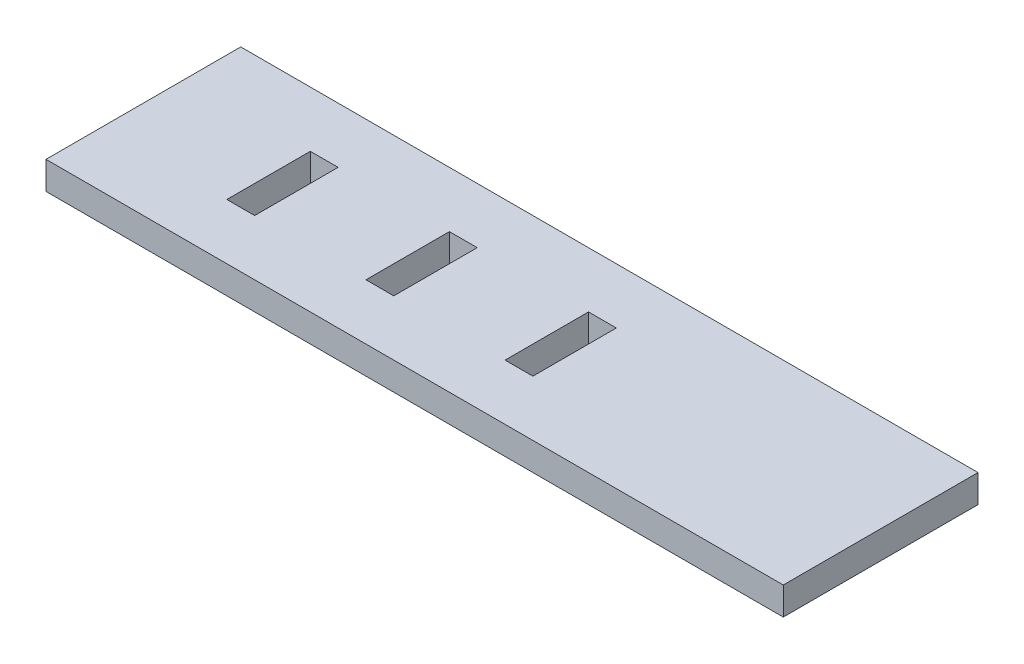
ISO-10303-21;
HEADER;
FILE_DESCRIPTION(('STEP AP214'),'2;1');
FILE_NAME('part.step','',(''),(''),'','','');
FILE_SCHEMA(('AUTOMOTIVE_DESIGN { 1 0 10303 214 1 1 1 1 }'));
ENDSEC;
DATA;
#1=APPLICATION_CONTEXT('core data for automotive mechanical design processes');
#2=APPLICATION_PROTOCOL_DEFINITION('international standard','automotive_design',2000,#1);
#3=PRODUCT_CONTEXT('',#1,'mechanical');
#4=PRODUCT('Part','Part','',(#3));
#5=PRODUCT_RELATED_PRODUCT_CATEGORY('part','',(#4));
#6=PRODUCT_DEFINITION_FORMATION('','',#4);
#7=PRODUCT_DEFINITION_CONTEXT('part definition',#1,'design');
#8=PRODUCT_DEFINITION('design','',#6,#7);
#9=PRODUCT_DEFINITION_SHAPE('','',#8);
#10=(LENGTH_UNIT() NAMED_UNIT(*) SI_UNIT(.MILLI.,.METRE.));
#11=(NAMED_UNIT(*) PLANE_ANGLE_UNIT() SI_UNIT($,.RADIAN.));
#12=(NAMED_UNIT(*) SI_UNIT($,.STERADIAN.) SOLID_ANGLE_UNIT());
#13=UNCERTAINTY_MEASURE_WITH_UNIT(LENGTH_MEASURE(1.E-05),#10,'distance_accuracy_value','');
#14=(GEOMETRIC_REPRESENTATION_CONTEXT(3) GLOBAL_UNCERTAINTY_ASSIGNED_CONTEXT((#13)) GLOBAL_UNIT_ASSIGNED_CONTEXT((#10,
#11,#12)) REPRESENTATION_CONTEXT('',''));
#15=CARTESIAN_POINT('',(0.,0.,0.));
#16=DIRECTION('',(0.,0.,1.));
#17=DIRECTION('',(1.,0.,0.));
#18=AXIS2_PLACEMENT_3D('',#15,#16,#17);
#19=CARTESIAN_POINT('',(0.,10.,0.));
#20=DIRECTION('',(0.,1.,0.));
#21=DIRECTION('',(0.,0.,1.));
#22=AXIS2_PLACEMENT_3D('',#19,#20,#21);
#23=PLANE('',#22);
#24=DIRECTION('',(0.,0.,1.));
#25=VECTOR('',#24,1.);
#26=CARTESIAN_POINT('',(-98.4246575342466,10.,-43.4931506849315));
#27=LINE('',#26,#25);
#28=CARTESIAN_POINT('',(-98.4246575342466,10.,-43.4931506849315));
#29=VERTEX_POINT('',#28);
#30=CARTESIAN_POINT('',(-98.4246575342466,10.,26.5068493150685));
#31=VERTEX_POINT('',#30);
#32=EDGE_CURVE('E246',#29,#31,#27,.T.);
#33=ORIENTED_EDGE('',*,*,#32,.T.);
#34=DIRECTION('',(1.,0.,0.));
#35=VECTOR('',#34,1.);
#36=CARTESIAN_POINT('',(-98.4246575342466,10.,26.5068493150685));
#37=LINE('',#36,#35);
#38=CARTESIAN_POINT('',(166.575342465753,10.,26.5068493150685));
#39=VERTEX_POINT('',#38);
#40=EDGE_CURVE('E249',#31,#39,#37,.T.);
#41=ORIENTED_EDGE('',*,*,#40,.T.);
#42=DIRECTION('',(0.,0.,-1.));
#43=VECTOR('',#42,1.);
#44=CARTESIAN_POINT('',(166.575342465753,10.,-43.4931506849315));
#45=LINE('',#44,#43);
#46=CARTESIAN_POINT('',(166.575342465753,10.,-43.4931506849315));
#47=VERTEX_POINT('',#46);
#48=EDGE_CURVE('E252',#39,#47,#45,.T.);
#49=ORIENTED_EDGE('',*,*,#48,.T.);
#50=DIRECTION('',(-1.,0.,0.));
#51=VECTOR('',#50,1.);
#52=CARTESIAN_POINT('',(-98.4246575342466,10.,-43.4931506849315));
#53=LINE('',#52,#51);
#54=EDGE_CURVE('E254',#47,#29,#53,.T.);
#55=ORIENTED_EDGE('',*,*,#54,.T.);
#56=EDGE_LOOP('',(#33,#41,#49,#55));
#57=FACE_BOUND('',#56,.T.);
#58=DIRECTION('',(-1.,0.,0.));
#59=VECTOR('',#58,1.);
#60=CARTESIAN_POINT('',(-53.4246575342466,10.,-23.4931506849315));
#61=LINE('',#60,#59);
#62=CARTESIAN_POINT('',(-43.4246575342466,10.,-23.4931506849315));
#63=VERTEX_POINT('',#62);
#64=CARTESIAN_POINT('',(-53.4246575342466,10.,-23.4931506849315));
#65=VERTEX_POINT('',#64);
#66=EDGE_CURVE('E217',#63,#65,#61,.T.);
#67=ORIENTED_EDGE('',*,*,#66,.F.);
#68=DIRECTION('',(0.,0.,-1.));
#69=VECTOR('',#68,1.);
#70=CARTESIAN_POINT('',(-43.4246575342466,10.,-23.4931506849315));
#71=LINE('',#70,#69);
#72=CARTESIAN_POINT('',(-43.4246575342466,10.,6.50684931506849));
#73=VERTEX_POINT('',#72);
#74=EDGE_CURVE('E215',#73,#63,#71,.T.);
#75=ORIENTED_EDGE('',*,*,#74,.F.);
#76=DIRECTION('',(1.,0.,0.));
#77=VECTOR('',#76,1.);
#78=CARTESIAN_POINT('',(-53.4246575342466,10.,6.50684931506849));
#79=LINE('',#78,#77);
#80=CARTESIAN_POINT('',(-53.4246575342466,10.,6.50684931506849));
#81=VERTEX_POINT('',#80);
#82=EDGE_CURVE('E223',#81,#73,#79,.T.);
#83=ORIENTED_EDGE('',*,*,#82,.F.);
#84=DIRECTION('',(0.,0.,1.));
#85=VECTOR('',#84,1.);
#86=CARTESIAN_POINT('',(-53.4246575342466,10.,-23.4931506849315));
#87=LINE('',#86,#85);
#88=EDGE_CURVE('E220',#65,#81,#87,.T.);
#89=ORIENTED_EDGE('',*,*,#88,.F.);
#90=EDGE_LOOP('',(#67,#75,#83,#89));
#91=FACE_BOUND('',#90,.T.);
#92=DIRECTION('',(1.,0.,0.));
#93=VECTOR('',#92,1.);
#94=CARTESIAN_POINT('',(6.57534246575341,10.,6.50684931506847));
#95=LINE('',#94,#93);
#96=CARTESIAN_POINT('',(-3.42465753424659,10.,6.50684931506847));
#97=VERTEX_POINT('',#96);
#98=CARTESIAN_POINT('',(6.57534246575341,10.,6.50684931506847));
#99=VERTEX_POINT('',#98);
#100=EDGE_CURVE('E186',#97,#99,#95,.T.);
#101=ORIENTED_EDGE('',*,*,#100,.F.);
#102=DIRECTION('',(0.,0.,1.));
#103=VECTOR('',#102,1.);
#104=CARTESIAN_POINT('',(-3.4246575342466,10.,-23.4931506849315));
#105=LINE('',#104,#103);
#106=CARTESIAN_POINT('',(-3.4246575342466,10.,-23.4931506849315));
#107=VERTEX_POINT('',#106);
#108=EDGE_CURVE('E184',#107,#97,#105,.T.);
#109=ORIENTED_EDGE('',*,*,#108,.F.);
#110=DIRECTION('',(-1.,0.,0.));
#111=VECTOR('',#110,1.);
#112=CARTESIAN_POINT('',(6.5753424657534,10.,-23.4931506849315));
#113=LINE('',#112,#111);
#114=CARTESIAN_POINT('',(6.5753424657534,10.,-23.4931506849315));
#115=VERTEX_POINT('',#114);
#116=EDGE_CURVE('E192',#115,#107,#113,.T.);
#117=ORIENTED_EDGE('',*,*,#116,.F.);
#118=DIRECTION('',(0.,0.,-1.));
#119=VECTOR('',#118,1.);
#120=CARTESIAN_POINT('',(6.5753424657534,10.,-23.4931506849315));
#121=LINE('',#120,#119);
#122=EDGE_CURVE('E189',#99,#115,#121,.T.);
#123=ORIENTED_EDGE('',*,*,#122,.F.);
#124=EDGE_LOOP('',(#101,#109,#117,#123));
#125=FACE_BOUND('',#124,.T.);
#126=DIRECTION('',(-1.,0.,0.));
#127=VECTOR('',#126,1.);
#128=CARTESIAN_POINT('',(46.5753424657534,10.,-23.4931506849315));
#129=LINE('',#128,#127);
#130=CARTESIAN_POINT('',(56.5753424657534,10.,-23.4931506849315));
#131=VERTEX_POINT('',#130);
#132=CARTESIAN_POINT('',(46.5753424657534,10.,-23.4931506849315));
#133=VERTEX_POINT('',#132);
#134=EDGE_CURVE('E156',#131,#133,#129,.T.);
#135=ORIENTED_EDGE('',*,*,#134,.F.);
#136=DIRECTION('',(0.,0.,-1.));
#137=VECTOR('',#136,1.);
#138=CARTESIAN_POINT('',(56.5753424657534,10.,-23.4931506849315));
#139=LINE('',#138,#137);
#140=CARTESIAN_POINT('',(56.5753424657534,10.,6.50684931506852));
#141=VERTEX_POINT('',#140);
#142=EDGE_CURVE('E148',#141,#131,#139,.T.);
#143=ORIENTED_EDGE('',*,*,#142,.F.);
#144=DIRECTION('',(1.,0.,0.));
#145=VECTOR('',#144,1.);
#146=CARTESIAN_POINT('',(46.5753424657534,10.,6.50684931506852));
#147=LINE('',#146,#145);
#148=CARTESIAN_POINT('',(46.5753424657534,10.,6.50684931506852));
#149=VERTEX_POINT('',#148);
#150=EDGE_CURVE('E170',#149,#141,#147,.T.);
#151=ORIENTED_EDGE('',*,*,#150,.F.);
#152=DIRECTION('',(0.,0.,1.));
#153=VECTOR('',#152,1.);
#154=CARTESIAN_POINT('',(46.5753424657534,10.,-23.4931506849315));
#155=LINE('',#154,#153);
#156=EDGE_CURVE('E168',#133,#149,#155,.T.);
#157=ORIENTED_EDGE('',*,*,#156,.F.);
#158=EDGE_LOOP('',(#135,#143,#151,#157));
#159=FACE_BOUND('',#158,.T.);
#160=ADVANCED_FACE('F35',(#57,#91,#125,#159),#23,.T.);
#161=CARTESIAN_POINT('',(0.,0.,0.));
#162=DIRECTION('',(0.,1.,0.));
#163=DIRECTION('',(0.,0.,1.));
#164=AXIS2_PLACEMENT_3D('',#161,#162,#163);
#165=PLANE('',#164);
#166=DIRECTION('',(0.,0.,1.));
#167=VECTOR('',#166,1.);
#168=CARTESIAN_POINT('',(-3.4246575342466,0.,-23.4931506849315));
#169=LINE('',#168,#167);
#170=CARTESIAN_POINT('',(-3.4246575342466,0.,-23.4931506849315));
#171=VERTEX_POINT('',#170);
#172=CARTESIAN_POINT('',(-3.42465753424659,0.,6.50684931506847));
#173=VERTEX_POINT('',#172);
#174=EDGE_CURVE('E164',#171,#173,#169,.T.);
#175=ORIENTED_EDGE('',*,*,#174,.T.);
#176=DIRECTION('',(1.,0.,0.));
#177=VECTOR('',#176,1.);
#178=CARTESIAN_POINT('',(6.57534246575341,0.,6.50684931506847));
#179=LINE('',#178,#177);
#180=CARTESIAN_POINT('',(6.57534246575341,0.,6.50684931506847));
#181=VERTEX_POINT('',#180);
#182=EDGE_CURVE('E197',#173,#181,#179,.T.);
#183=ORIENTED_EDGE('',*,*,#182,.T.);
#184=DIRECTION('',(0.,0.,-1.));
#185=VECTOR('',#184,1.);
#186=CARTESIAN_POINT('',(6.5753424657534,0.,-23.4931506849315));
#187=LINE('',#186,#185);
#188=CARTESIAN_POINT('',(6.5753424657534,0.,-23.4931506849315));
#189=VERTEX_POINT('',#188);
#190=EDGE_CURVE('E200',#181,#189,#187,.T.);
#191=ORIENTED_EDGE('',*,*,#190,.T.);
#192=DIRECTION('',(-1.,0.,0.));
#193=VECTOR('',#192,1.);
#194=CARTESIAN_POINT('',(6.5753424657534,0.,-23.4931506849315));
#195=LINE('',#194,#193);
#196=EDGE_CURVE('E187',#189,#171,#195,.T.);
#197=ORIENTED_EDGE('',*,*,#196,.T.);
#198=EDGE_LOOP('',(#175,#183,#191,#197));
#199=FACE_BOUND('',#198,.T.);
#200=DIRECTION('',(0.,0.,1.));
#201=VECTOR('',#200,1.);
#202=CARTESIAN_POINT('',(-98.4246575342466,0.,-43.4931506849315));
#203=LINE('',#202,#201);
#204=CARTESIAN_POINT('',(-98.4246575342466,0.,-43.4931506849315));
#205=VERTEX_POINT('',#204);
#206=CARTESIAN_POINT('',(-98.4246575342466,0.,26.5068493150685));
#207=VERTEX_POINT('',#206);
#208=EDGE_CURVE('E245',#205,#207,#203,.T.);
#209=ORIENTED_EDGE('',*,*,#208,.F.);
#210=DIRECTION('',(-1.,0.,0.));
#211=VECTOR('',#210,1.);
#212=CARTESIAN_POINT('',(-98.4246575342466,0.,-43.4931506849315));
#213=LINE('',#212,#211);
#214=CARTESIAN_POINT('',(166.575342465753,0.,-43.4931506849315));
#215=VERTEX_POINT('',#214);
#216=EDGE_CURVE('E250',#215,#205,#213,.T.);
#217=ORIENTED_EDGE('',*,*,#216,.F.);
#218=DIRECTION('',(0.,0.,-1.));
#219=VECTOR('',#218,1.);
#220=CARTESIAN_POINT('',(166.575342465753,0.,-43.4931506849315));
#221=LINE('',#220,#219);
#222=CARTESIAN_POINT('',(166.575342465753,0.,26.5068493150685));
#223=VERTEX_POINT('',#222);
#224=EDGE_CURVE('E261',#223,#215,#221,.T.);
#225=ORIENTED_EDGE('',*,*,#224,.F.);
#226=DIRECTION('',(1.,0.,0.));
#227=VECTOR('',#226,1.);
#228=CARTESIAN_POINT('',(-98.4246575342466,0.,26.5068493150685));
#229=LINE('',#228,#227);
#230=EDGE_CURVE('E259',#207,#223,#229,.T.);
#231=ORIENTED_EDGE('',*,*,#230,.F.);
#232=EDGE_LOOP('',(#209,#217,#225,#231));
#233=FACE_BOUND('',#232,.T.);
#234=DIRECTION('',(0.,0.,-1.));
#235=VECTOR('',#234,1.);
#236=CARTESIAN_POINT('',(-43.4246575342466,0.,-23.4931506849315));
#237=LINE('',#236,#235);
#238=CARTESIAN_POINT('',(-43.4246575342466,0.,6.50684931506849));
#239=VERTEX_POINT('',#238);
#240=CARTESIAN_POINT('',(-43.4246575342466,0.,-23.4931506849315));
#241=VERTEX_POINT('',#240);
#242=EDGE_CURVE('E214',#239,#241,#237,.T.);
#243=ORIENTED_EDGE('',*,*,#242,.T.);
#244=DIRECTION('',(-1.,0.,0.));
#245=VECTOR('',#244,1.);
#246=CARTESIAN_POINT('',(-53.4246575342466,0.,-23.4931506849315));
#247=LINE('',#246,#245);
#248=CARTESIAN_POINT('',(-53.4246575342466,0.,-23.4931506849315));
#249=VERTEX_POINT('',#248);
#250=EDGE_CURVE('E228',#241,#249,#247,.T.);
#251=ORIENTED_EDGE('',*,*,#250,.T.);
#252=DIRECTION('',(0.,0.,1.));
#253=VECTOR('',#252,1.);
#254=CARTESIAN_POINT('',(-53.4246575342466,0.,-23.4931506849315));
#255=LINE('',#254,#253);
#256=CARTESIAN_POINT('',(-53.4246575342466,0.,6.50684931506849));
#257=VERTEX_POINT('',#256);
#258=EDGE_CURVE('E231',#249,#257,#255,.T.);
#259=ORIENTED_EDGE('',*,*,#258,.T.);
#260=DIRECTION('',(1.,0.,0.));
#261=VECTOR('',#260,1.);
#262=CARTESIAN_POINT('',(-53.4246575342466,0.,6.50684931506849));
#263=LINE('',#262,#261);
#264=EDGE_CURVE('E218',#257,#239,#263,.T.);
#265=ORIENTED_EDGE('',*,*,#264,.T.);
#266=EDGE_LOOP('',(#243,#251,#259,#265));
#267=FACE_BOUND('',#266,.T.);
#268=DIRECTION('',(0.,0.,-1.));
#269=VECTOR('',#268,1.);
#270=CARTESIAN_POINT('',(56.5753424657534,0.,-23.4931506849315));
#271=LINE('',#270,#269);
#272=CARTESIAN_POINT('',(56.5753424657534,0.,6.50684931506852));
#273=VERTEX_POINT('',#272);
#274=CARTESIAN_POINT('',(56.5753424657534,0.,-23.4931506849315));
#275=VERTEX_POINT('',#274);
#276=EDGE_CURVE('E58',#273,#275,#271,.T.);
#277=ORIENTED_EDGE('',*,*,#276,.T.);
#278=DIRECTION('',(-1.,0.,0.));
#279=VECTOR('',#278,1.);
#280=CARTESIAN_POINT('',(46.5753424657534,0.,-23.4931506849315));
#281=LINE('',#280,#279);
#282=CARTESIAN_POINT('',(46.5753424657534,0.,-23.4931506849315));
#283=VERTEX_POINT('',#282);
#284=EDGE_CURVE('E163',#275,#283,#281,.T.);
#285=ORIENTED_EDGE('',*,*,#284,.T.);
#286=DIRECTION('',(0.,0.,1.));
#287=VECTOR('',#286,1.);
#288=CARTESIAN_POINT('',(46.5753424657534,0.,-23.4931506849315));
#289=LINE('',#288,#287);
#290=CARTESIAN_POINT('',(46.5753424657534,0.,6.50684931506852));
#291=VERTEX_POINT('',#290);
#292=EDGE_CURVE('E176',#283,#291,#289,.T.);
#293=ORIENTED_EDGE('',*,*,#292,.T.);
#294=DIRECTION('',(1.,0.,0.));
#295=VECTOR('',#294,1.);
#296=CARTESIAN_POINT('',(46.5753424657534,0.,6.50684931506852));
#297=LINE('',#296,#295);
#298=EDGE_CURVE('E157',#291,#273,#297,.T.);
#299=ORIENTED_EDGE('',*,*,#298,.T.);
#300=EDGE_LOOP('',(#277,#285,#293,#299));
#301=FACE_BOUND('',#300,.T.);
#302=ADVANCED_FACE('F279',(#199,#233,#267,#301),#165,.F.);
#303=CARTESIAN_POINT('',(-98.4246575342466,10.,-43.4931506849315));
#304=DIRECTION('',(1.,0.,0.));
#305=DIRECTION('',(0.,0.,-1.));
#306=AXIS2_PLACEMENT_3D('',#303,#304,#305);
#307=PLANE('',#306);
#308=ORIENTED_EDGE('',*,*,#208,.T.);
#309=DIRECTION('',(0.,-1.,0.));
#310=VECTOR('',#309,1.);
#311=CARTESIAN_POINT('',(-98.4246575342466,10.,26.5068493150685));
#312=LINE('',#311,#310);
#313=EDGE_CURVE('E11',#31,#207,#312,.T.);
#314=ORIENTED_EDGE('',*,*,#313,.F.);
#315=ORIENTED_EDGE('',*,*,#32,.F.);
#316=DIRECTION('',(0.,-1.,0.));
#317=VECTOR('',#316,1.);
#318=CARTESIAN_POINT('',(-98.4246575342466,10.,-43.4931506849315));
#319=LINE('',#318,#317);
#320=EDGE_CURVE('E256',#29,#205,#319,.T.);
#321=ORIENTED_EDGE('',*,*,#320,.T.);
#322=EDGE_LOOP('',(#308,#314,#315,#321));
#323=FACE_BOUND('',#322,.T.);
#324=ADVANCED_FACE('F37',(#323),#307,.F.);
#325=CARTESIAN_POINT('',(-98.4246575342466,10.,26.5068493150685));
#326=DIRECTION('',(0.,0.,-1.));
#327=DIRECTION('',(-1.,0.,0.));
#328=AXIS2_PLACEMENT_3D('',#325,#326,#327);
#329=PLANE('',#328);
#330=ORIENTED_EDGE('',*,*,#230,.T.);
#331=DIRECTION('',(0.,-1.,0.));
#332=VECTOR('',#331,1.);
#333=CARTESIAN_POINT('',(166.575342465753,10.,26.5068493150685));
#334=LINE('',#333,#332);
#335=EDGE_CURVE('E43',#39,#223,#334,.T.);
#336=ORIENTED_EDGE('',*,*,#335,.F.);
#337=ORIENTED_EDGE('',*,*,#40,.F.);
#338=ORIENTED_EDGE('',*,*,#313,.T.);
#339=EDGE_LOOP('',(#330,#336,#337,#338));
#340=FACE_BOUND('',#339,.T.);
#341=ADVANCED_FACE('F290',(#340),#329,.F.);
#342=CARTESIAN_POINT('',(166.575342465753,10.,-43.4931506849315));
#343=DIRECTION('',(-1.,0.,0.));
#344=DIRECTION('',(0.,0.,1.));
#345=AXIS2_PLACEMENT_3D('',#342,#343,#344);
#346=PLANE('',#345);
#347=ORIENTED_EDGE('',*,*,#224,.T.);
#348=DIRECTION('',(0.,-1.,0.));
#349=VECTOR('',#348,1.);
#350=CARTESIAN_POINT('',(166.575342465753,10.,-43.4931506849315));
#351=LINE('',#350,#349);
#352=EDGE_CURVE('E266',#47,#215,#351,.T.);
#353=ORIENTED_EDGE('',*,*,#352,.F.);
#354=ORIENTED_EDGE('',*,*,#48,.F.);
#355=ORIENTED_EDGE('',*,*,#335,.T.);
#356=EDGE_LOOP('',(#347,#353,#354,#355));
#357=FACE_BOUND('',#356,.T.);
#358=ADVANCED_FACE('F273',(#357),#346,.F.);
#359=CARTESIAN_POINT('',(-98.4246575342466,10.,-43.4931506849315));
#360=DIRECTION('',(0.,0.,1.));
#361=DIRECTION('',(1.,0.,0.));
#362=AXIS2_PLACEMENT_3D('',#359,#360,#361);
#363=PLANE('',#362);
#364=ORIENTED_EDGE('',*,*,#216,.T.);
#365=ORIENTED_EDGE('',*,*,#320,.F.);
#366=ORIENTED_EDGE('',*,*,#54,.F.);
#367=ORIENTED_EDGE('',*,*,#352,.T.);
#368=EDGE_LOOP('',(#364,#365,#366,#367));
#369=FACE_BOUND('',#368,.T.);
#370=ADVANCED_FACE('F283',(#369),#363,.F.);
#371=CARTESIAN_POINT('',(-43.4246575342466,10.,-23.4931506849315));
#372=DIRECTION('',(-1.,0.,0.));
#373=DIRECTION('',(0.,0.,1.));
#374=AXIS2_PLACEMENT_3D('',#371,#372,#373);
#375=PLANE('',#374);
#376=ORIENTED_EDGE('',*,*,#242,.F.);
#377=DIRECTION('',(0.,-1.,0.));
#378=VECTOR('',#377,1.);
#379=CARTESIAN_POINT('',(-43.4246575342466,10.,6.50684931506849));
#380=LINE('',#379,#378);
#381=EDGE_CURVE('E225',#73,#239,#380,.T.);
#382=ORIENTED_EDGE('',*,*,#381,.F.);
#383=ORIENTED_EDGE('',*,*,#74,.T.);
#384=DIRECTION('',(0.,-1.,0.));
#385=VECTOR('',#384,1.);
#386=CARTESIAN_POINT('',(-43.4246575342466,10.,-23.4931506849315));
#387=LINE('',#386,#385);
#388=EDGE_CURVE('E242',#63,#241,#387,.T.);
#389=ORIENTED_EDGE('',*,*,#388,.T.);
#390=EDGE_LOOP('',(#376,#382,#383,#389));
#391=FACE_BOUND('',#390,.T.);
#392=ADVANCED_FACE('F305',(#391),#375,.T.);
#393=CARTESIAN_POINT('',(-53.4246575342466,10.,-23.4931506849315));
#394=DIRECTION('',(0.,0.,1.));
#395=DIRECTION('',(1.,0.,0.));
#396=AXIS2_PLACEMENT_3D('',#393,#394,#395);
#397=PLANE('',#396);
#398=ORIENTED_EDGE('',*,*,#250,.F.);
#399=ORIENTED_EDGE('',*,*,#388,.F.);
#400=ORIENTED_EDGE('',*,*,#66,.T.);
#401=DIRECTION('',(0.,-1.,0.));
#402=VECTOR('',#401,1.);
#403=CARTESIAN_POINT('',(-53.4246575342466,10.,-23.4931506849315));
#404=LINE('',#403,#402);
#405=EDGE_CURVE('E240',#65,#249,#404,.T.);
#406=ORIENTED_EDGE('',*,*,#405,.T.);
#407=EDGE_LOOP('',(#398,#399,#400,#406));
#408=FACE_BOUND('',#407,.T.);
#409=ADVANCED_FACE('F312',(#408),#397,.T.);
#410=CARTESIAN_POINT('',(-53.4246575342466,10.,-23.4931506849315));
#411=DIRECTION('',(1.,0.,0.));
#412=DIRECTION('',(0.,0.,-1.));
#413=AXIS2_PLACEMENT_3D('',#410,#411,#412);
#414=PLANE('',#413);
#415=ORIENTED_EDGE('',*,*,#258,.F.);
#416=ORIENTED_EDGE('',*,*,#405,.F.);
#417=ORIENTED_EDGE('',*,*,#88,.T.);
#418=DIRECTION('',(0.,-1.,0.));
#419=VECTOR('',#418,1.);
#420=CARTESIAN_POINT('',(-53.4246575342466,10.,6.50684931506849));
#421=LINE('',#420,#419);
#422=EDGE_CURVE('E238',#81,#257,#421,.T.);
#423=ORIENTED_EDGE('',*,*,#422,.T.);
#424=EDGE_LOOP('',(#415,#416,#417,#423));
#425=FACE_BOUND('',#424,.T.);
#426=ADVANCED_FACE('F317',(#425),#414,.T.);
#427=CARTESIAN_POINT('',(-53.4246575342466,10.,6.50684931506849));
#428=DIRECTION('',(0.,0.,-1.));
#429=DIRECTION('',(-1.,0.,0.));
#430=AXIS2_PLACEMENT_3D('',#427,#428,#429);
#431=PLANE('',#430);
#432=ORIENTED_EDGE('',*,*,#264,.F.);
#433=ORIENTED_EDGE('',*,*,#422,.F.);
#434=ORIENTED_EDGE('',*,*,#82,.T.);
#435=ORIENTED_EDGE('',*,*,#381,.T.);
#436=EDGE_LOOP('',(#432,#433,#434,#435));
#437=FACE_BOUND('',#436,.T.);
#438=ADVANCED_FACE('F324',(#437),#431,.T.);
#439=CARTESIAN_POINT('',(-3.4246575342466,10.,-23.4931506849315));
#440=DIRECTION('',(1.,0.,0.));
#441=DIRECTION('',(0.,0.,-1.));
#442=AXIS2_PLACEMENT_3D('',#439,#440,#441);
#443=PLANE('',#442);
#444=ORIENTED_EDGE('',*,*,#174,.F.);
#445=DIRECTION('',(0.,-1.,0.));
#446=VECTOR('',#445,1.);
#447=CARTESIAN_POINT('',(-3.4246575342466,10.,-23.4931506849315));
#448=LINE('',#447,#446);
#449=EDGE_CURVE('E194',#107,#171,#448,.T.);
#450=ORIENTED_EDGE('',*,*,#449,.F.);
#451=ORIENTED_EDGE('',*,*,#108,.T.);
#452=DIRECTION('',(0.,-1.,0.));
#453=VECTOR('',#452,1.);
#454=CARTESIAN_POINT('',(-3.42465753424659,10.,6.50684931506847));
#455=LINE('',#454,#453);
#456=EDGE_CURVE('E211',#97,#173,#455,.T.);
#457=ORIENTED_EDGE('',*,*,#456,.T.);
#458=EDGE_LOOP('',(#444,#450,#451,#457));
#459=FACE_BOUND('',#458,.T.);
#460=ADVANCED_FACE('F346',(#459),#443,.T.);
#461=CARTESIAN_POINT('',(6.57534246575341,10.,6.50684931506847));
#462=DIRECTION('',(0.,0.,-1.));
#463=DIRECTION('',(-1.,0.,0.));
#464=AXIS2_PLACEMENT_3D('',#461,#462,#463);
#465=PLANE('',#464);
#466=ORIENTED_EDGE('',*,*,#182,.F.);
#467=ORIENTED_EDGE('',*,*,#456,.F.);
#468=ORIENTED_EDGE('',*,*,#100,.T.);
#469=DIRECTION('',(0.,-1.,0.));
#470=VECTOR('',#469,1.);
#471=CARTESIAN_POINT('',(6.57534246575341,10.,6.50684931506847));
#472=LINE('',#471,#470);
#473=EDGE_CURVE('E209',#99,#181,#472,.T.);
#474=ORIENTED_EDGE('',*,*,#473,.T.);
#475=EDGE_LOOP('',(#466,#467,#468,#474));
#476=FACE_BOUND('',#475,.T.);
#477=ADVANCED_FACE('F340',(#476),#465,.T.);
#478=CARTESIAN_POINT('',(6.5753424657534,10.,-23.4931506849315));
#479=DIRECTION('',(-1.,0.,0.));
#480=DIRECTION('',(0.,0.,1.));
#481=AXIS2_PLACEMENT_3D('',#478,#479,#480);
#482=PLANE('',#481);
#483=ORIENTED_EDGE('',*,*,#190,.F.);
#484=ORIENTED_EDGE('',*,*,#473,.F.);
#485=ORIENTED_EDGE('',*,*,#122,.T.);
#486=DIRECTION('',(0.,-1.,0.));
#487=VECTOR('',#486,1.);
#488=CARTESIAN_POINT('',(6.5753424657534,10.,-23.4931506849315));
#489=LINE('',#488,#487);
#490=EDGE_CURVE('E207',#115,#189,#489,.T.);
#491=ORIENTED_EDGE('',*,*,#490,.T.);
#492=EDGE_LOOP('',(#483,#484,#485,#491));
#493=FACE_BOUND('',#492,.T.);
#494=ADVANCED_FACE('F343',(#493),#482,.T.);
#495=CARTESIAN_POINT('',(6.5753424657534,10.,-23.4931506849315));
#496=DIRECTION('',(0.,0.,1.));
#497=DIRECTION('',(1.,0.,0.));
#498=AXIS2_PLACEMENT_3D('',#495,#496,#497);
#499=PLANE('',#498);
#500=ORIENTED_EDGE('',*,*,#196,.F.);
#501=ORIENTED_EDGE('',*,*,#490,.F.);
#502=ORIENTED_EDGE('',*,*,#116,.T.);
#503=ORIENTED_EDGE('',*,*,#449,.T.);
#504=EDGE_LOOP('',(#500,#501,#502,#503));
#505=FACE_BOUND('',#504,.T.);
#506=ADVANCED_FACE('F349',(#505),#499,.T.);
#507=CARTESIAN_POINT('',(56.5753424657534,10.,-23.4931506849315));
#508=DIRECTION('',(-1.,0.,0.));
#509=DIRECTION('',(0.,0.,1.));
#510=AXIS2_PLACEMENT_3D('',#507,#508,#509);
#511=PLANE('',#510);
#512=ORIENTED_EDGE('',*,*,#276,.F.);
#513=DIRECTION('',(0.,-1.,0.));
#514=VECTOR('',#513,1.);
#515=CARTESIAN_POINT('',(56.5753424657534,10.,6.50684931506852));
#516=LINE('',#515,#514);
#517=EDGE_CURVE('E152',#141,#273,#516,.T.);
#518=ORIENTED_EDGE('',*,*,#517,.F.);
#519=ORIENTED_EDGE('',*,*,#142,.T.);
#520=DIRECTION('',(0.,-1.,0.));
#521=VECTOR('',#520,1.);
#522=CARTESIAN_POINT('',(56.5753424657534,10.,-23.4931506849315));
#523=LINE('',#522,#521);
#524=EDGE_CURVE('E151',#131,#275,#523,.T.);
#525=ORIENTED_EDGE('',*,*,#524,.T.);
#526=EDGE_LOOP('',(#512,#518,#519,#525));
#527=FACE_BOUND('',#526,.T.);
#528=ADVANCED_FACE('F150',(#527),#511,.T.);
#529=CARTESIAN_POINT('',(46.5753424657534,10.,-23.4931506849315));
#530=DIRECTION('',(0.,0.,1.));
#531=DIRECTION('',(1.,0.,0.));
#532=AXIS2_PLACEMENT_3D('',#529,#530,#531);
#533=PLANE('',#532);
#534=ORIENTED_EDGE('',*,*,#284,.F.);
#535=ORIENTED_EDGE('',*,*,#524,.F.);
#536=ORIENTED_EDGE('',*,*,#134,.T.);
#537=DIRECTION('',(0.,-1.,0.));
#538=VECTOR('',#537,1.);
#539=CARTESIAN_POINT('',(46.5753424657534,10.,-23.4931506849315));
#540=LINE('',#539,#538);
#541=EDGE_CURVE('E165',#133,#283,#540,.T.);
#542=ORIENTED_EDGE('',*,*,#541,.T.);
#543=EDGE_LOOP('',(#534,#535,#536,#542));
#544=FACE_BOUND('',#543,.T.);
#545=ADVANCED_FACE('F160',(#544),#533,.T.);
#546=CARTESIAN_POINT('',(46.5753424657534,10.,-23.4931506849315));
#547=DIRECTION('',(1.,0.,0.));
#548=DIRECTION('',(0.,0.,-1.));
#549=AXIS2_PLACEMENT_3D('',#546,#547,#548);
#550=PLANE('',#549);
#551=ORIENTED_EDGE('',*,*,#292,.F.);
#552=ORIENTED_EDGE('',*,*,#541,.F.);
#553=ORIENTED_EDGE('',*,*,#156,.T.);
#554=DIRECTION('',(0.,-1.,0.));
#555=VECTOR('',#554,1.);
#556=CARTESIAN_POINT('',(46.5753424657534,10.,6.50684931506852));
#557=LINE('',#556,#555);
#558=EDGE_CURVE('E50',#149,#291,#557,.T.);
#559=ORIENTED_EDGE('',*,*,#558,.T.);
#560=EDGE_LOOP('',(#551,#552,#553,#559));
#561=FACE_BOUND('',#560,.T.);
#562=ADVANCED_FACE('F406',(#561),#550,.T.);
#563=CARTESIAN_POINT('',(46.5753424657534,10.,6.50684931506852));
#564=DIRECTION('',(0.,0.,-1.));
#565=DIRECTION('',(-1.,0.,0.));
#566=AXIS2_PLACEMENT_3D('',#563,#564,#565);
#567=PLANE('',#566);
#568=ORIENTED_EDGE('',*,*,#298,.F.);
#569=ORIENTED_EDGE('',*,*,#558,.F.);
#570=ORIENTED_EDGE('',*,*,#150,.T.);
#571=ORIENTED_EDGE('',*,*,#517,.T.);
#572=EDGE_LOOP('',(#568,#569,#570,#571));
#573=FACE_BOUND('',#572,.T.);
#574=ADVANCED_FACE('F414',(#573),#567,.T.);
#575=CLOSED_SHELL('',(#160,#302,#324,#341,#358,#370,#392,#409,#426,#438,#460,#477,#494,#506,
#528,#545,#562,#574));
#576=MANIFOLD_SOLID_BREP('B2',#575);
#577=ADVANCED_BREP_SHAPE_REPRESENTATION('',(#18,#576),#14);
#578=SHAPE_DEFINITION_REPRESENTATION(#9,#577);
ENDSEC;
END-ISO-10303-21;
